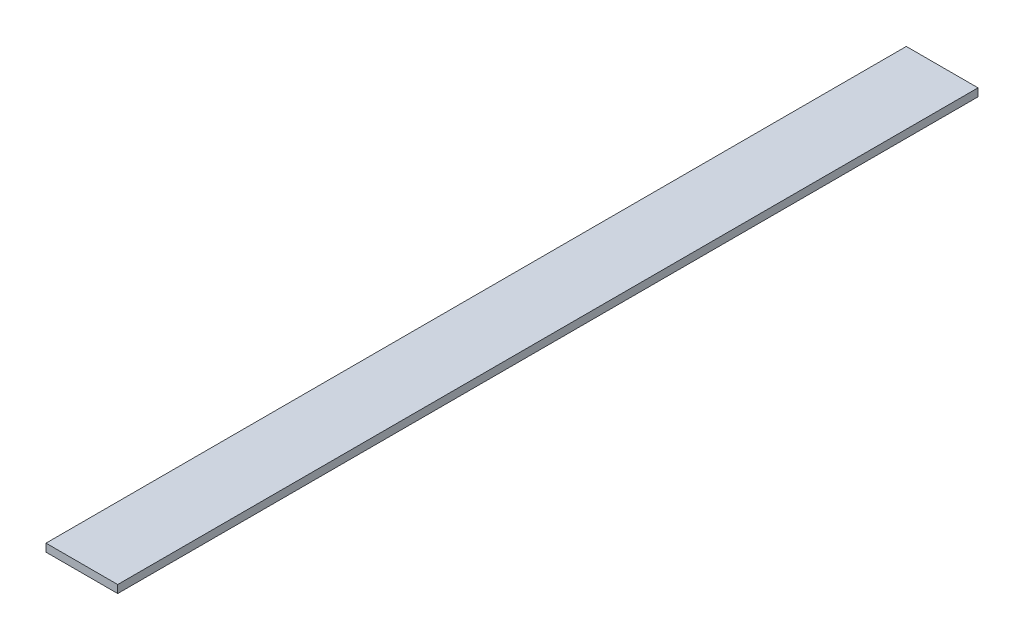
ISO-10303-21;
HEADER;
FILE_DESCRIPTION(('STEP AP214'),'2;1');
FILE_NAME('part.step','',(''),(''),'','','');
FILE_SCHEMA(('AUTOMOTIVE_DESIGN { 1 0 10303 214 1 1 1 1 }'));
ENDSEC;
DATA;
#1=APPLICATION_CONTEXT('core data for automotive mechanical design processes');
#2=APPLICATION_PROTOCOL_DEFINITION('international standard','automotive_design',2000,#1);
#3=PRODUCT_CONTEXT('',#1,'mechanical');
#4=PRODUCT('Part','Part','',(#3));
#5=PRODUCT_RELATED_PRODUCT_CATEGORY('part','',(#4));
#6=PRODUCT_DEFINITION_FORMATION('','',#4);
#7=PRODUCT_DEFINITION_CONTEXT('part definition',#1,'design');
#8=PRODUCT_DEFINITION('design','',#6,#7);
#9=PRODUCT_DEFINITION_SHAPE('','',#8);
#10=(LENGTH_UNIT() NAMED_UNIT(*) SI_UNIT(.MILLI.,.METRE.));
#11=(NAMED_UNIT(*) PLANE_ANGLE_UNIT() SI_UNIT($,.RADIAN.));
#12=(NAMED_UNIT(*) SI_UNIT($,.STERADIAN.) SOLID_ANGLE_UNIT());
#13=UNCERTAINTY_MEASURE_WITH_UNIT(LENGTH_MEASURE(1.E-05),#10,'distance_accuracy_value','');
#14=(GEOMETRIC_REPRESENTATION_CONTEXT(3) GLOBAL_UNCERTAINTY_ASSIGNED_CONTEXT((#13)) GLOBAL_UNIT_ASSIGNED_CONTEXT((#10,
#11,#12)) REPRESENTATION_CONTEXT('',''));
#15=CARTESIAN_POINT('',(0.,0.,0.));
#16=DIRECTION('',(0.,0.,1.));
#17=DIRECTION('',(1.,0.,0.));
#18=AXIS2_PLACEMENT_3D('',#15,#16,#17);
#19=CARTESIAN_POINT('',(-50.8,-5.55625,609.6));
#20=DIRECTION('',(1.,0.,0.));
#21=DIRECTION('',(0.,0.,-1.));
#22=AXIS2_PLACEMENT_3D('',#19,#20,#21);
#23=PLANE('',#22);
#24=DIRECTION('',(0.,-1.,0.));
#25=VECTOR('',#24,1.);
#26=CARTESIAN_POINT('',(-50.8,-5.55625,-609.6));
#27=LINE('',#26,#25);
#28=CARTESIAN_POINT('',(-50.8,5.55625,-609.6));
#29=VERTEX_POINT('',#28);
#30=CARTESIAN_POINT('',(-50.8,-5.55625,-609.6));
#31=VERTEX_POINT('',#30);
#32=EDGE_CURVE('E97',#29,#31,#27,.T.);
#33=ORIENTED_EDGE('',*,*,#32,.T.);
#34=DIRECTION('',(0.,0.,-1.));
#35=VECTOR('',#34,1.);
#36=CARTESIAN_POINT('',(-50.8,-5.55625,609.6));
#37=LINE('',#36,#35);
#38=CARTESIAN_POINT('',(-50.8,-5.55625,609.6));
#39=VERTEX_POINT('',#38);
#40=EDGE_CURVE('E11',#39,#31,#37,.T.);
#41=ORIENTED_EDGE('',*,*,#40,.F.);
#42=DIRECTION('',(0.,-1.,0.));
#43=VECTOR('',#42,1.);
#44=CARTESIAN_POINT('',(-50.8,-5.55625,609.6));
#45=LINE('',#44,#43);
#46=CARTESIAN_POINT('',(-50.8,5.55625,609.6));
#47=VERTEX_POINT('',#46);
#48=EDGE_CURVE('E85',#47,#39,#45,.T.);
#49=ORIENTED_EDGE('',*,*,#48,.F.);
#50=DIRECTION('',(0.,0.,-1.));
#51=VECTOR('',#50,1.);
#52=CARTESIAN_POINT('',(-50.8,5.55625,609.6));
#53=LINE('',#52,#51);
#54=EDGE_CURVE('E93',#47,#29,#53,.T.);
#55=ORIENTED_EDGE('',*,*,#54,.T.);
#56=EDGE_LOOP('',(#33,#41,#49,#55));
#57=FACE_BOUND('',#56,.T.);
#58=ADVANCED_FACE('F34',(#57),#23,.F.);
#59=CARTESIAN_POINT('',(50.8,-5.55625,609.6));
#60=DIRECTION('',(0.,1.,0.));
#61=DIRECTION('',(0.,0.,1.));
#62=AXIS2_PLACEMENT_3D('',#59,#60,#61);
#63=PLANE('',#62);
#64=DIRECTION('',(1.,0.,0.));
#65=VECTOR('',#64,1.);
#66=CARTESIAN_POINT('',(50.8,-5.55625,-609.6));
#67=LINE('',#66,#65);
#68=CARTESIAN_POINT('',(50.8,-5.55625,-609.6));
#69=VERTEX_POINT('',#68);
#70=EDGE_CURVE('E89',#31,#69,#67,.T.);
#71=ORIENTED_EDGE('',*,*,#70,.T.);
#72=DIRECTION('',(0.,0.,-1.));
#73=VECTOR('',#72,1.);
#74=CARTESIAN_POINT('',(50.8,-5.55625,609.6));
#75=LINE('',#74,#73);
#76=CARTESIAN_POINT('',(50.8,-5.55625,609.6));
#77=VERTEX_POINT('',#76);
#78=EDGE_CURVE('E42',#77,#69,#75,.T.);
#79=ORIENTED_EDGE('',*,*,#78,.F.);
#80=DIRECTION('',(1.,0.,0.));
#81=VECTOR('',#80,1.);
#82=CARTESIAN_POINT('',(50.8,-5.55625,609.6));
#83=LINE('',#82,#81);
#84=EDGE_CURVE('E80',#39,#77,#83,.T.);
#85=ORIENTED_EDGE('',*,*,#84,.F.);
#86=ORIENTED_EDGE('',*,*,#40,.T.);
#87=EDGE_LOOP('',(#71,#79,#85,#86));
#88=FACE_BOUND('',#87,.T.);
#89=ADVANCED_FACE('F88',(#88),#63,.F.);
#90=CARTESIAN_POINT('',(50.8,5.55625,609.6));
#91=DIRECTION('',(-1.,0.,0.));
#92=DIRECTION('',(0.,0.,1.));
#93=AXIS2_PLACEMENT_3D('',#90,#91,#92);
#94=PLANE('',#93);
#95=DIRECTION('',(0.,1.,0.));
#96=VECTOR('',#95,1.);
#97=CARTESIAN_POINT('',(50.8,5.55625,-609.6));
#98=LINE('',#97,#96);
#99=CARTESIAN_POINT('',(50.8,5.55625,-609.6));
#100=VERTEX_POINT('',#99);
#101=EDGE_CURVE('E67',#69,#100,#98,.T.);
#102=ORIENTED_EDGE('',*,*,#101,.T.);
#103=DIRECTION('',(0.,0.,-1.));
#104=VECTOR('',#103,1.);
#105=CARTESIAN_POINT('',(50.8,5.55625,609.6));
#106=LINE('',#105,#104);
#107=CARTESIAN_POINT('',(50.8,5.55625,609.6));
#108=VERTEX_POINT('',#107);
#109=EDGE_CURVE('E90',#108,#100,#106,.T.);
#110=ORIENTED_EDGE('',*,*,#109,.F.);
#111=DIRECTION('',(0.,1.,0.));
#112=VECTOR('',#111,1.);
#113=CARTESIAN_POINT('',(50.8,5.55625,609.6));
#114=LINE('',#113,#112);
#115=EDGE_CURVE('E83',#77,#108,#114,.T.);
#116=ORIENTED_EDGE('',*,*,#115,.F.);
#117=ORIENTED_EDGE('',*,*,#78,.T.);
#118=EDGE_LOOP('',(#102,#110,#116,#117));
#119=FACE_BOUND('',#118,.T.);
#120=ADVANCED_FACE('F91',(#119),#94,.F.);
#121=CARTESIAN_POINT('',(-50.8,5.55625,609.6));
#122=DIRECTION('',(0.,-1.,0.));
#123=DIRECTION('',(0.,0.,-1.));
#124=AXIS2_PLACEMENT_3D('',#121,#122,#123);
#125=PLANE('',#124);
#126=DIRECTION('',(-1.,0.,0.));
#127=VECTOR('',#126,1.);
#128=CARTESIAN_POINT('',(-50.8,5.55625,-609.6));
#129=LINE('',#128,#127);
#130=EDGE_CURVE('E73',#100,#29,#129,.T.);
#131=ORIENTED_EDGE('',*,*,#130,.T.);
#132=ORIENTED_EDGE('',*,*,#54,.F.);
#133=DIRECTION('',(-1.,0.,0.));
#134=VECTOR('',#133,1.);
#135=CARTESIAN_POINT('',(-50.8,5.55625,609.6));
#136=LINE('',#135,#134);
#137=EDGE_CURVE('E50',#108,#47,#136,.T.);
#138=ORIENTED_EDGE('',*,*,#137,.F.);
#139=ORIENTED_EDGE('',*,*,#109,.T.);
#140=EDGE_LOOP('',(#131,#132,#138,#139));
#141=FACE_BOUND('',#140,.T.);
#142=ADVANCED_FACE('F104',(#141),#125,.F.);
#143=CARTESIAN_POINT('',(0.,0.,609.6));
#144=DIRECTION('',(0.,0.,-1.));
#145=DIRECTION('',(-1.,0.,0.));
#146=AXIS2_PLACEMENT_3D('',#143,#144,#145);
#147=PLANE('',#146);
#148=ORIENTED_EDGE('',*,*,#48,.T.);
#149=ORIENTED_EDGE('',*,*,#84,.T.);
#150=ORIENTED_EDGE('',*,*,#115,.T.);
#151=ORIENTED_EDGE('',*,*,#137,.T.);
#152=EDGE_LOOP('',(#148,#149,#150,#151));
#153=FACE_BOUND('',#152,.T.);
#154=ADVANCED_FACE('F81',(#153),#147,.F.);
#155=CARTESIAN_POINT('',(0.,0.,-609.6));
#156=DIRECTION('',(0.,0.,-1.));
#157=DIRECTION('',(-1.,0.,0.));
#158=AXIS2_PLACEMENT_3D('',#155,#156,#157);
#159=PLANE('',#158);
#160=ORIENTED_EDGE('',*,*,#32,.F.);
#161=ORIENTED_EDGE('',*,*,#130,.F.);
#162=ORIENTED_EDGE('',*,*,#101,.F.);
#163=ORIENTED_EDGE('',*,*,#70,.F.);
#164=EDGE_LOOP('',(#160,#161,#162,#163));
#165=FACE_BOUND('',#164,.T.);
#166=ADVANCED_FACE('F107',(#165),#159,.T.);
#167=CLOSED_SHELL('',(#58,#89,#120,#142,#154,#166));
#168=MANIFOLD_SOLID_BREP('B2',#167);
#169=ADVANCED_BREP_SHAPE_REPRESENTATION('',(#18,#168),#14);
#170=SHAPE_DEFINITION_REPRESENTATION(#9,#169);
ENDSEC;
END-ISO-10303-21;
